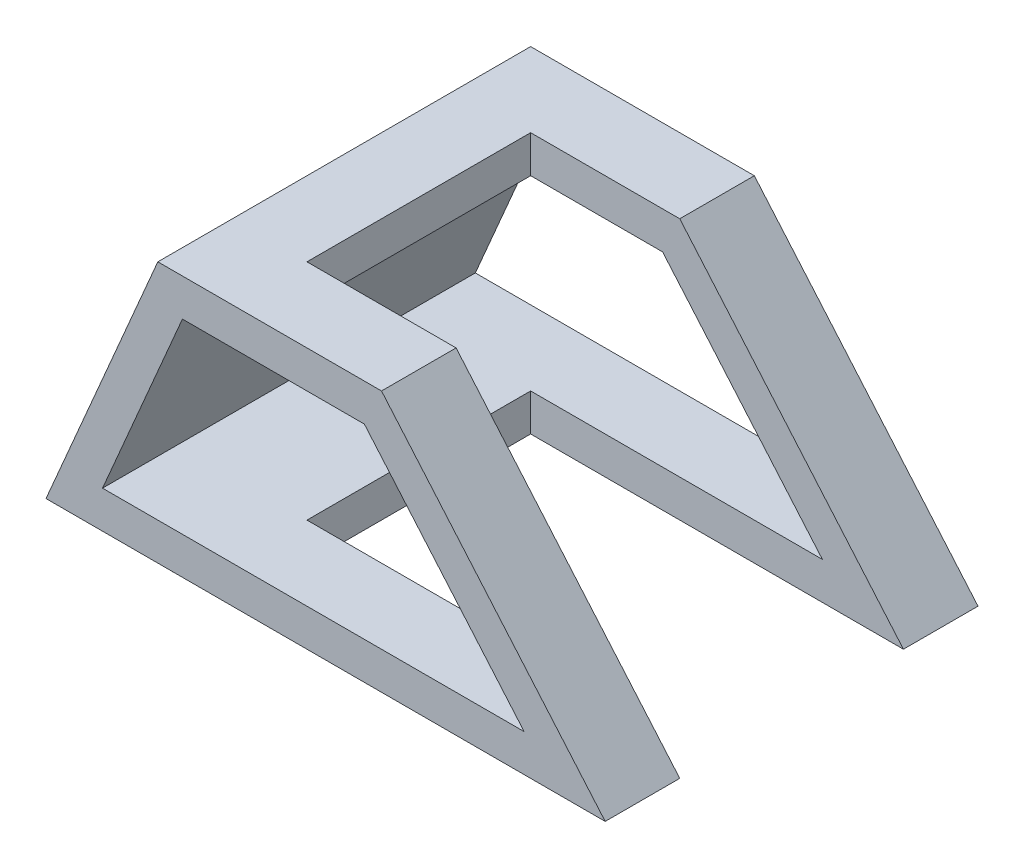
ISO-10303-21;
HEADER;
FILE_DESCRIPTION(('STEP AP214'),'2;1');
FILE_NAME('part.step','',(''),(''),'','','');
FILE_SCHEMA(('AUTOMOTIVE_DESIGN { 1 0 10303 214 1 1 1 1 }'));
ENDSEC;
DATA;
#1=APPLICATION_CONTEXT('core data for automotive mechanical design processes');
#2=APPLICATION_PROTOCOL_DEFINITION('international standard','automotive_design',2000,#1);
#3=PRODUCT_CONTEXT('',#1,'mechanical');
#4=PRODUCT('Part','Part','',(#3));
#5=PRODUCT_RELATED_PRODUCT_CATEGORY('part','',(#4));
#6=PRODUCT_DEFINITION_FORMATION('','',#4);
#7=PRODUCT_DEFINITION_CONTEXT('part definition',#1,'design');
#8=PRODUCT_DEFINITION('design','',#6,#7);
#9=PRODUCT_DEFINITION_SHAPE('','',#8);
#10=(LENGTH_UNIT() NAMED_UNIT(*) SI_UNIT(.MILLI.,.METRE.));
#11=(NAMED_UNIT(*) PLANE_ANGLE_UNIT() SI_UNIT($,.RADIAN.));
#12=(NAMED_UNIT(*) SI_UNIT($,.STERADIAN.) SOLID_ANGLE_UNIT());
#13=UNCERTAINTY_MEASURE_WITH_UNIT(LENGTH_MEASURE(1.E-05),#10,'distance_accuracy_value','');
#14=(GEOMETRIC_REPRESENTATION_CONTEXT(3) GLOBAL_UNCERTAINTY_ASSIGNED_CONTEXT((#13)) GLOBAL_UNIT_ASSIGNED_CONTEXT((#10,
#11,#12)) REPRESENTATION_CONTEXT('',''));
#15=CARTESIAN_POINT('',(0.,0.,0.));
#16=DIRECTION('',(0.,0.,1.));
#17=DIRECTION('',(1.,0.,0.));
#18=AXIS2_PLACEMENT_3D('',#15,#16,#17);
#19=CARTESIAN_POINT('',(150.,0.,50.));
#20=DIRECTION('',(0.,1.,0.));
#21=DIRECTION('',(0.,0.,1.));
#22=AXIS2_PLACEMENT_3D('',#19,#20,#21);
#23=PLANE('',#22);
#24=DIRECTION('',(-1.,0.,0.));
#25=VECTOR('',#24,1.);
#26=CARTESIAN_POINT('',(150.,0.,-30.));
#27=LINE('',#26,#25);
#28=CARTESIAN_POINT('',(150.,0.,-30.));
#29=VERTEX_POINT('',#28);
#30=CARTESIAN_POINT('',(50.,0.,-30.));
#31=VERTEX_POINT('',#30);
#32=EDGE_CURVE('E173',#29,#31,#27,.T.);
#33=ORIENTED_EDGE('',*,*,#32,.T.);
#34=DIRECTION('',(0.,0.,1.));
#35=VECTOR('',#34,1.);
#36=CARTESIAN_POINT('',(50.,0.,30.));
#37=LINE('',#36,#35);
#38=CARTESIAN_POINT('',(50.,0.,30.));
#39=VERTEX_POINT('',#38);
#40=EDGE_CURVE('E176',#31,#39,#37,.T.);
#41=ORIENTED_EDGE('',*,*,#40,.T.);
#42=DIRECTION('',(1.,0.,0.));
#43=VECTOR('',#42,1.);
#44=CARTESIAN_POINT('',(150.,0.,30.));
#45=LINE('',#44,#43);
#46=CARTESIAN_POINT('',(150.,0.,30.));
#47=VERTEX_POINT('',#46);
#48=EDGE_CURVE('E158',#39,#47,#45,.T.);
#49=ORIENTED_EDGE('',*,*,#48,.T.);
#50=DIRECTION('',(0.,0.,-1.));
#51=VECTOR('',#50,1.);
#52=CARTESIAN_POINT('',(150.,0.,50.));
#53=LINE('',#52,#51);
#54=CARTESIAN_POINT('',(150.,0.,50.));
#55=VERTEX_POINT('',#54);
#56=EDGE_CURVE('E261',#55,#47,#53,.T.);
#57=ORIENTED_EDGE('',*,*,#56,.F.);
#58=DIRECTION('',(1.,0.,0.));
#59=VECTOR('',#58,1.);
#60=CARTESIAN_POINT('',(150.,0.,50.));
#61=LINE('',#60,#59);
#62=CARTESIAN_POINT('',(0.,0.,50.));
#63=VERTEX_POINT('',#62);
#64=EDGE_CURVE('E233',#63,#55,#61,.T.);
#65=ORIENTED_EDGE('',*,*,#64,.F.);
#66=DIRECTION('',(0.,0.,-1.));
#67=VECTOR('',#66,1.);
#68=CARTESIAN_POINT('',(0.,0.,50.));
#69=LINE('',#68,#67);
#70=CARTESIAN_POINT('',(0.,0.,-50.));
#71=VERTEX_POINT('',#70);
#72=EDGE_CURVE('E243',#63,#71,#69,.T.);
#73=ORIENTED_EDGE('',*,*,#72,.T.);
#74=DIRECTION('',(1.,0.,0.));
#75=VECTOR('',#74,1.);
#76=CARTESIAN_POINT('',(150.,0.,-50.));
#77=LINE('',#76,#75);
#78=CARTESIAN_POINT('',(150.,0.,-50.));
#79=VERTEX_POINT('',#78);
#80=EDGE_CURVE('E232',#71,#79,#77,.T.);
#81=ORIENTED_EDGE('',*,*,#80,.T.);
#82=EDGE_CURVE('E260',#29,#79,#53,.T.);
#83=ORIENTED_EDGE('',*,*,#82,.F.);
#84=EDGE_LOOP('',(#33,#41,#49,#57,#65,#73,#81,#83));
#85=FACE_BOUND('',#84,.T.);
#86=ADVANCED_FACE('F37',(#85),#23,.F.);
#87=CARTESIAN_POINT('',(90.,70.,50.));
#88=DIRECTION('',(-0.759256602365297,-0.650791373455968,0.));
#89=DIRECTION('',(0.650791373455968,-0.759256602365297,0.));
#90=AXIS2_PLACEMENT_3D('',#87,#88,#89);
#91=PLANE('',#90);
#92=DIRECTION('',(-0.650791373455968,0.759256602365297,0.));
#93=VECTOR('',#92,1.);
#94=CARTESIAN_POINT('',(90.,70.,-30.));
#95=LINE('',#94,#93);
#96=CARTESIAN_POINT('',(90.,70.,-30.));
#97=VERTEX_POINT('',#96);
#98=EDGE_CURVE('E153',#29,#97,#95,.T.);
#99=ORIENTED_EDGE('',*,*,#98,.F.);
#100=ORIENTED_EDGE('',*,*,#82,.T.);
#101=DIRECTION('',(-0.650791373455968,0.759256602365297,0.));
#102=VECTOR('',#101,1.);
#103=CARTESIAN_POINT('',(90.,70.,-50.));
#104=LINE('',#103,#102);
#105=CARTESIAN_POINT('',(90.,70.,-50.));
#106=VERTEX_POINT('',#105);
#107=EDGE_CURVE('E246',#79,#106,#104,.T.);
#108=ORIENTED_EDGE('',*,*,#107,.T.);
#109=DIRECTION('',(0.,0.,-1.));
#110=VECTOR('',#109,1.);
#111=CARTESIAN_POINT('',(90.,70.,50.));
#112=LINE('',#111,#110);
#113=EDGE_CURVE('E257',#97,#106,#112,.T.);
#114=ORIENTED_EDGE('',*,*,#113,.F.);
#115=EDGE_LOOP('',(#99,#100,#108,#114));
#116=FACE_BOUND('',#115,.T.);
#117=ADVANCED_FACE('F286',(#116),#91,.F.);
#118=DIRECTION('',(0.650791373455968,-0.759256602365297,0.));
#119=VECTOR('',#118,1.);
#120=CARTESIAN_POINT('',(90.,70.,30.));
#121=LINE('',#120,#119);
#122=CARTESIAN_POINT('',(90.,70.,30.));
#123=VERTEX_POINT('',#122);
#124=EDGE_CURVE('E186',#123,#47,#121,.T.);
#125=ORIENTED_EDGE('',*,*,#124,.F.);
#126=CARTESIAN_POINT('',(90.,70.,50.));
#127=VERTEX_POINT('',#126);
#128=EDGE_CURVE('E258',#127,#123,#112,.T.);
#129=ORIENTED_EDGE('',*,*,#128,.F.);
#130=DIRECTION('',(-0.650791373455968,0.759256602365297,0.));
#131=VECTOR('',#130,1.);
#132=CARTESIAN_POINT('',(90.,70.,50.));
#133=LINE('',#132,#131);
#134=EDGE_CURVE('E236',#55,#127,#133,.T.);
#135=ORIENTED_EDGE('',*,*,#134,.F.);
#136=ORIENTED_EDGE('',*,*,#56,.T.);
#137=EDGE_LOOP('',(#125,#129,#135,#136));
#138=FACE_BOUND('',#137,.T.);
#139=ADVANCED_FACE('F308',(#138),#91,.F.);
#140=CARTESIAN_POINT('',(30.,70.,50.));
#141=DIRECTION('',(0.,-1.,0.));
#142=DIRECTION('',(0.,0.,-1.));
#143=AXIS2_PLACEMENT_3D('',#140,#141,#142);
#144=PLANE('',#143);
#145=DIRECTION('',(-1.,0.,0.));
#146=VECTOR('',#145,1.);
#147=CARTESIAN_POINT('',(150.,70.,-30.));
#148=LINE('',#147,#146);
#149=CARTESIAN_POINT('',(50.,70.,-30.));
#150=VERTEX_POINT('',#149);
#151=EDGE_CURVE('E148',#97,#150,#148,.T.);
#152=ORIENTED_EDGE('',*,*,#151,.F.);
#153=ORIENTED_EDGE('',*,*,#113,.T.);
#154=DIRECTION('',(-1.,0.,0.));
#155=VECTOR('',#154,1.);
#156=CARTESIAN_POINT('',(30.,70.,-50.));
#157=LINE('',#156,#155);
#158=CARTESIAN_POINT('',(30.,70.,-50.));
#159=VERTEX_POINT('',#158);
#160=EDGE_CURVE('E249',#106,#159,#157,.T.);
#161=ORIENTED_EDGE('',*,*,#160,.T.);
#162=DIRECTION('',(0.,0.,-1.));
#163=VECTOR('',#162,1.);
#164=CARTESIAN_POINT('',(30.,70.,50.));
#165=LINE('',#164,#163);
#166=CARTESIAN_POINT('',(30.,70.,50.));
#167=VERTEX_POINT('',#166);
#168=EDGE_CURVE('E254',#167,#159,#165,.T.);
#169=ORIENTED_EDGE('',*,*,#168,.F.);
#170=DIRECTION('',(-1.,0.,0.));
#171=VECTOR('',#170,1.);
#172=CARTESIAN_POINT('',(30.,70.,50.));
#173=LINE('',#172,#171);
#174=EDGE_CURVE('E239',#127,#167,#173,.T.);
#175=ORIENTED_EDGE('',*,*,#174,.F.);
#176=ORIENTED_EDGE('',*,*,#128,.T.);
#177=DIRECTION('',(1.,0.,0.));
#178=VECTOR('',#177,1.);
#179=CARTESIAN_POINT('',(150.,70.,30.));
#180=LINE('',#179,#178);
#181=CARTESIAN_POINT('',(50.,70.,30.));
#182=VERTEX_POINT('',#181);
#183=EDGE_CURVE('E168',#182,#123,#180,.T.);
#184=ORIENTED_EDGE('',*,*,#183,.F.);
#185=DIRECTION('',(0.,0.,1.));
#186=VECTOR('',#185,1.);
#187=CARTESIAN_POINT('',(50.,70.,30.));
#188=LINE('',#187,#186);
#189=EDGE_CURVE('E157',#150,#182,#188,.T.);
#190=ORIENTED_EDGE('',*,*,#189,.F.);
#191=EDGE_LOOP('',(#152,#153,#161,#169,#175,#176,#184,#190));
#192=FACE_BOUND('',#191,.T.);
#193=ADVANCED_FACE('F166',(#192),#144,.F.);
#194=CARTESIAN_POINT('',(128.257793632439,10.,50.));
#195=DIRECTION('',(0.,1.,0.));
#196=DIRECTION('',(-1.,0.,0.));
#197=AXIS2_PLACEMENT_3D('',#194,#195,#196);
#198=PLANE('',#197);
#199=DIRECTION('',(0.,0.,-1.));
#200=VECTOR('',#199,1.);
#201=CARTESIAN_POINT('',(50.,10.,50.));
#202=LINE('',#201,#200);
#203=CARTESIAN_POINT('',(50.,10.,30.));
#204=VERTEX_POINT('',#203);
#205=CARTESIAN_POINT('',(50.,10.,-30.));
#206=VERTEX_POINT('',#205);
#207=EDGE_CURVE('E188',#204,#206,#202,.T.);
#208=ORIENTED_EDGE('',*,*,#207,.T.);
#209=DIRECTION('',(1.,0.,0.));
#210=VECTOR('',#209,1.);
#211=CARTESIAN_POINT('',(128.257793632439,10.,-30.));
#212=LINE('',#211,#210);
#213=CARTESIAN_POINT('',(128.257793632439,9.99999999999999,-30.));
#214=VERTEX_POINT('',#213);
#215=EDGE_CURVE('E194',#206,#214,#212,.T.);
#216=ORIENTED_EDGE('',*,*,#215,.T.);
#217=DIRECTION('',(0.,0.,-1.));
#218=VECTOR('',#217,1.);
#219=CARTESIAN_POINT('',(128.257793632439,10.,50.));
#220=LINE('',#219,#218);
#221=CARTESIAN_POINT('',(128.257793632439,10.,-50.));
#222=VERTEX_POINT('',#221);
#223=EDGE_CURVE('E228',#214,#222,#220,.T.);
#224=ORIENTED_EDGE('',*,*,#223,.T.);
#225=DIRECTION('',(1.,0.,0.));
#226=VECTOR('',#225,1.);
#227=CARTESIAN_POINT('',(128.257793632439,10.,-50.));
#228=LINE('',#227,#226);
#229=CARTESIAN_POINT('',(15.1653901512342,10.,-50.));
#230=VERTEX_POINT('',#229);
#231=EDGE_CURVE('E198',#230,#222,#228,.T.);
#232=ORIENTED_EDGE('',*,*,#231,.F.);
#233=DIRECTION('',(0.,0.,-1.));
#234=VECTOR('',#233,1.);
#235=CARTESIAN_POINT('',(15.1653901512342,10.,50.));
#236=LINE('',#235,#234);
#237=CARTESIAN_POINT('',(15.1653901512342,10.,50.));
#238=VERTEX_POINT('',#237);
#239=EDGE_CURVE('E209',#238,#230,#236,.T.);
#240=ORIENTED_EDGE('',*,*,#239,.F.);
#241=DIRECTION('',(1.,0.,0.));
#242=VECTOR('',#241,1.);
#243=CARTESIAN_POINT('',(128.257793632439,10.,50.));
#244=LINE('',#243,#242);
#245=CARTESIAN_POINT('',(128.257793632439,10.,50.));
#246=VERTEX_POINT('',#245);
#247=EDGE_CURVE('E199',#238,#246,#244,.T.);
#248=ORIENTED_EDGE('',*,*,#247,.T.);
#249=CARTESIAN_POINT('',(128.257793632439,10.,30.));
#250=VERTEX_POINT('',#249);
#251=EDGE_CURVE('E229',#246,#250,#220,.T.);
#252=ORIENTED_EDGE('',*,*,#251,.T.);
#253=DIRECTION('',(-1.,0.,0.));
#254=VECTOR('',#253,1.);
#255=CARTESIAN_POINT('',(128.257793632439,10.,30.));
#256=LINE('',#255,#254);
#257=EDGE_CURVE('E183',#250,#204,#256,.T.);
#258=ORIENTED_EDGE('',*,*,#257,.T.);
#259=EDGE_LOOP('',(#208,#216,#224,#232,#240,#248,#252,#258));
#260=FACE_BOUND('',#259,.T.);
#261=ADVANCED_FACE('F275',(#260),#198,.T.);
#262=CARTESIAN_POINT('',(85.4006507752959,60.,50.));
#263=DIRECTION('',(-0.759256602365296,-0.650791373455969,0.));
#264=DIRECTION('',(0.650791373455969,-0.759256602365296,0.));
#265=AXIS2_PLACEMENT_3D('',#262,#263,#264);
#266=PLANE('',#265);
#267=ORIENTED_EDGE('',*,*,#223,.F.);
#268=DIRECTION('',(-0.650791373455969,0.759256602365296,0.));
#269=VECTOR('',#268,1.);
#270=CARTESIAN_POINT('',(85.4006507752959,60.,-30.));
#271=LINE('',#270,#269);
#272=CARTESIAN_POINT('',(85.4006507752959,60.,-30.));
#273=VERTEX_POINT('',#272);
#274=EDGE_CURVE('E191',#214,#273,#271,.T.);
#275=ORIENTED_EDGE('',*,*,#274,.T.);
#276=DIRECTION('',(0.,0.,-1.));
#277=VECTOR('',#276,1.);
#278=CARTESIAN_POINT('',(85.4006507752959,60.,50.));
#279=LINE('',#278,#277);
#280=CARTESIAN_POINT('',(85.4006507752959,60.,-50.));
#281=VERTEX_POINT('',#280);
#282=EDGE_CURVE('E224',#273,#281,#279,.T.);
#283=ORIENTED_EDGE('',*,*,#282,.T.);
#284=DIRECTION('',(-0.650791373455969,0.759256602365296,0.));
#285=VECTOR('',#284,1.);
#286=CARTESIAN_POINT('',(85.4006507752959,60.,-50.));
#287=LINE('',#286,#285);
#288=EDGE_CURVE('E212',#222,#281,#287,.T.);
#289=ORIENTED_EDGE('',*,*,#288,.F.);
#290=EDGE_LOOP('',(#267,#275,#283,#289));
#291=FACE_BOUND('',#290,.T.);
#292=ADVANCED_FACE('F272',(#291),#266,.T.);
#293=CARTESIAN_POINT('',(85.4006507752959,60.,50.));
#294=VERTEX_POINT('',#293);
#295=CARTESIAN_POINT('',(85.4006507752959,60.,30.));
#296=VERTEX_POINT('',#295);
#297=EDGE_CURVE('E225',#294,#296,#279,.T.);
#298=ORIENTED_EDGE('',*,*,#297,.T.);
#299=DIRECTION('',(0.650791373455969,-0.759256602365296,0.));
#300=VECTOR('',#299,1.);
#301=CARTESIAN_POINT('',(85.4006507752959,60.,30.));
#302=LINE('',#301,#300);
#303=EDGE_CURVE('E57',#296,#250,#302,.T.);
#304=ORIENTED_EDGE('',*,*,#303,.T.);
#305=ORIENTED_EDGE('',*,*,#251,.F.);
#306=DIRECTION('',(-0.650791373455969,0.759256602365296,0.));
#307=VECTOR('',#306,1.);
#308=CARTESIAN_POINT('',(85.4006507752959,60.,50.));
#309=LINE('',#308,#307);
#310=EDGE_CURVE('E201',#246,#294,#309,.T.);
#311=ORIENTED_EDGE('',*,*,#310,.T.);
#312=EDGE_LOOP('',(#298,#304,#305,#311));
#313=FACE_BOUND('',#312,.T.);
#314=ADVANCED_FACE('F314',(#313),#266,.T.);
#315=CARTESIAN_POINT('',(36.5939615798056,60.,50.));
#316=DIRECTION('',(0.,-1.,0.));
#317=DIRECTION('',(0.,0.,-1.));
#318=AXIS2_PLACEMENT_3D('',#315,#316,#317);
#319=PLANE('',#318);
#320=ORIENTED_EDGE('',*,*,#282,.F.);
#321=DIRECTION('',(-1.,0.,0.));
#322=VECTOR('',#321,1.);
#323=CARTESIAN_POINT('',(36.5939615798056,60.,-30.));
#324=LINE('',#323,#322);
#325=CARTESIAN_POINT('',(50.,60.,-30.));
#326=VERTEX_POINT('',#325);
#327=EDGE_CURVE('E11',#273,#326,#324,.T.);
#328=ORIENTED_EDGE('',*,*,#327,.T.);
#329=DIRECTION('',(0.,0.,1.));
#330=VECTOR('',#329,1.);
#331=CARTESIAN_POINT('',(50.,60.,50.));
#332=LINE('',#331,#330);
#333=CARTESIAN_POINT('',(50.,60.,30.));
#334=VERTEX_POINT('',#333);
#335=EDGE_CURVE('E44',#326,#334,#332,.T.);
#336=ORIENTED_EDGE('',*,*,#335,.T.);
#337=DIRECTION('',(1.,0.,0.));
#338=VECTOR('',#337,1.);
#339=CARTESIAN_POINT('',(36.5939615798056,60.,30.));
#340=LINE('',#339,#338);
#341=EDGE_CURVE('E264',#334,#296,#340,.T.);
#342=ORIENTED_EDGE('',*,*,#341,.T.);
#343=ORIENTED_EDGE('',*,*,#297,.F.);
#344=DIRECTION('',(-1.,0.,0.));
#345=VECTOR('',#344,1.);
#346=CARTESIAN_POINT('',(36.5939615798056,60.,50.));
#347=LINE('',#346,#345);
#348=CARTESIAN_POINT('',(36.5939615798056,60.,50.));
#349=VERTEX_POINT('',#348);
#350=EDGE_CURVE('E204',#294,#349,#347,.T.);
#351=ORIENTED_EDGE('',*,*,#350,.T.);
#352=DIRECTION('',(0.,0.,-1.));
#353=VECTOR('',#352,1.);
#354=CARTESIAN_POINT('',(36.5939615798056,60.,50.));
#355=LINE('',#354,#353);
#356=CARTESIAN_POINT('',(36.5939615798056,60.,-50.));
#357=VERTEX_POINT('',#356);
#358=EDGE_CURVE('E222',#349,#357,#355,.T.);
#359=ORIENTED_EDGE('',*,*,#358,.T.);
#360=DIRECTION('',(-1.,0.,0.));
#361=VECTOR('',#360,1.);
#362=CARTESIAN_POINT('',(36.5939615798056,60.,-50.));
#363=LINE('',#362,#361);
#364=EDGE_CURVE('E215',#281,#357,#363,.T.);
#365=ORIENTED_EDGE('',*,*,#364,.F.);
#366=EDGE_LOOP('',(#320,#328,#336,#342,#343,#351,#359,#365));
#367=FACE_BOUND('',#366,.T.);
#368=ADVANCED_FACE('F267',(#367),#319,.T.);
#369=CARTESIAN_POINT('',(0.,0.,50.));
#370=DIRECTION('',(0.,0.,-1.));
#371=DIRECTION('',(-1.,0.,0.));
#372=AXIS2_PLACEMENT_3D('',#369,#370,#371);
#373=PLANE('',#372);
#374=ORIENTED_EDGE('',*,*,#64,.T.);
#375=ORIENTED_EDGE('',*,*,#134,.T.);
#376=ORIENTED_EDGE('',*,*,#174,.T.);
#377=DIRECTION('',(-0.393919298579168,-0.919145030018058,0.));
#378=VECTOR('',#377,1.);
#379=CARTESIAN_POINT('',(0.,0.,50.));
#380=LINE('',#379,#378);
#381=EDGE_CURVE('E241',#167,#63,#380,.T.);
#382=ORIENTED_EDGE('',*,*,#381,.T.);
#383=EDGE_LOOP('',(#374,#375,#376,#382));
#384=FACE_BOUND('',#383,.T.);
#385=ORIENTED_EDGE('',*,*,#247,.F.);
#386=DIRECTION('',(-0.393919298579168,-0.919145030018058,0.));
#387=VECTOR('',#386,1.);
#388=CARTESIAN_POINT('',(15.1653901512342,10.,50.));
#389=LINE('',#388,#387);
#390=EDGE_CURVE('E207',#349,#238,#389,.T.);
#391=ORIENTED_EDGE('',*,*,#390,.F.);
#392=ORIENTED_EDGE('',*,*,#350,.F.);
#393=ORIENTED_EDGE('',*,*,#310,.F.);
#394=EDGE_LOOP('',(#385,#391,#392,#393));
#395=FACE_BOUND('',#394,.T.);
#396=ADVANCED_FACE('F303',(#384,#395),#373,.F.);
#397=CARTESIAN_POINT('',(0.,0.,-50.));
#398=DIRECTION('',(0.,0.,-1.));
#399=DIRECTION('',(-1.,0.,0.));
#400=AXIS2_PLACEMENT_3D('',#397,#398,#399);
#401=PLANE('',#400);
#402=ORIENTED_EDGE('',*,*,#80,.F.);
#403=DIRECTION('',(-0.393919298579168,-0.919145030018058,0.));
#404=VECTOR('',#403,1.);
#405=CARTESIAN_POINT('',(0.,0.,-50.));
#406=LINE('',#405,#404);
#407=EDGE_CURVE('E237',#159,#71,#406,.T.);
#408=ORIENTED_EDGE('',*,*,#407,.F.);
#409=ORIENTED_EDGE('',*,*,#160,.F.);
#410=ORIENTED_EDGE('',*,*,#107,.F.);
#411=EDGE_LOOP('',(#402,#408,#409,#410));
#412=FACE_BOUND('',#411,.T.);
#413=DIRECTION('',(-0.393919298579168,-0.919145030018058,0.));
#414=VECTOR('',#413,1.);
#415=CARTESIAN_POINT('',(15.1653901512342,10.,-50.));
#416=LINE('',#415,#414);
#417=EDGE_CURVE('E202',#357,#230,#416,.T.);
#418=ORIENTED_EDGE('',*,*,#417,.T.);
#419=ORIENTED_EDGE('',*,*,#231,.T.);
#420=ORIENTED_EDGE('',*,*,#288,.T.);
#421=ORIENTED_EDGE('',*,*,#364,.T.);
#422=EDGE_LOOP('',(#418,#419,#420,#421));
#423=FACE_BOUND('',#422,.T.);
#424=ADVANCED_FACE('F298',(#412,#423),#401,.T.);
#425=CARTESIAN_POINT('',(0.,0.,50.));
#426=DIRECTION('',(0.919145030018058,-0.393919298579168,0.));
#427=DIRECTION('',(0.393919298579168,0.919145030018058,0.));
#428=AXIS2_PLACEMENT_3D('',#425,#426,#427);
#429=PLANE('',#428);
#430=ORIENTED_EDGE('',*,*,#407,.T.);
#431=ORIENTED_EDGE('',*,*,#72,.F.);
#432=ORIENTED_EDGE('',*,*,#381,.F.);
#433=ORIENTED_EDGE('',*,*,#168,.T.);
#434=EDGE_LOOP('',(#430,#431,#432,#433));
#435=FACE_BOUND('',#434,.T.);
#436=ADVANCED_FACE('F295',(#435),#429,.F.);
#437=CARTESIAN_POINT('',(15.1653901512342,10.,50.));
#438=DIRECTION('',(0.919145030018058,-0.393919298579168,0.));
#439=DIRECTION('',(0.393919298579168,0.919145030018058,0.));
#440=AXIS2_PLACEMENT_3D('',#437,#438,#439);
#441=PLANE('',#440);
#442=ORIENTED_EDGE('',*,*,#417,.F.);
#443=ORIENTED_EDGE('',*,*,#358,.F.);
#444=ORIENTED_EDGE('',*,*,#390,.T.);
#445=ORIENTED_EDGE('',*,*,#239,.T.);
#446=EDGE_LOOP('',(#442,#443,#444,#445));
#447=FACE_BOUND('',#446,.T.);
#448=ADVANCED_FACE('F319',(#447),#441,.T.);
#449=CARTESIAN_POINT('',(150.,70.,-30.));
#450=DIRECTION('',(0.,0.,1.));
#451=DIRECTION('',(1.,0.,0.));
#452=AXIS2_PLACEMENT_3D('',#449,#450,#451);
#453=PLANE('',#452);
#454=ORIENTED_EDGE('',*,*,#98,.T.);
#455=ORIENTED_EDGE('',*,*,#151,.T.);
#456=DIRECTION('',(0.,-1.,0.));
#457=VECTOR('',#456,1.);
#458=CARTESIAN_POINT('',(50.,70.,-30.));
#459=LINE('',#458,#457);
#460=EDGE_CURVE('E151',#150,#326,#459,.T.);
#461=ORIENTED_EDGE('',*,*,#460,.T.);
#462=ORIENTED_EDGE('',*,*,#327,.F.);
#463=ORIENTED_EDGE('',*,*,#274,.F.);
#464=ORIENTED_EDGE('',*,*,#215,.F.);
#465=EDGE_CURVE('E164',#206,#31,#459,.T.);
#466=ORIENTED_EDGE('',*,*,#465,.T.);
#467=ORIENTED_EDGE('',*,*,#32,.F.);
#468=EDGE_LOOP('',(#454,#455,#461,#462,#463,#464,#466,#467));
#469=FACE_BOUND('',#468,.T.);
#470=ADVANCED_FACE('F150',(#469),#453,.T.);
#471=CARTESIAN_POINT('',(50.,70.,30.));
#472=DIRECTION('',(1.,0.,0.));
#473=DIRECTION('',(0.,0.,-1.));
#474=AXIS2_PLACEMENT_3D('',#471,#472,#473);
#475=PLANE('',#474);
#476=DIRECTION('',(0.,-1.,0.));
#477=VECTOR('',#476,1.);
#478=CARTESIAN_POINT('',(50.,70.,30.));
#479=LINE('',#478,#477);
#480=EDGE_CURVE('E170',#204,#39,#479,.T.);
#481=ORIENTED_EDGE('',*,*,#480,.T.);
#482=ORIENTED_EDGE('',*,*,#40,.F.);
#483=ORIENTED_EDGE('',*,*,#465,.F.);
#484=ORIENTED_EDGE('',*,*,#207,.F.);
#485=EDGE_LOOP('',(#481,#482,#483,#484));
#486=FACE_BOUND('',#485,.T.);
#487=ADVANCED_FACE('F280',(#486),#475,.T.);
#488=CARTESIAN_POINT('',(150.,70.,30.));
#489=DIRECTION('',(0.,0.,-1.));
#490=DIRECTION('',(-1.,0.,0.));
#491=AXIS2_PLACEMENT_3D('',#488,#489,#490);
#492=PLANE('',#491);
#493=ORIENTED_EDGE('',*,*,#124,.T.);
#494=ORIENTED_EDGE('',*,*,#48,.F.);
#495=ORIENTED_EDGE('',*,*,#480,.F.);
#496=ORIENTED_EDGE('',*,*,#257,.F.);
#497=ORIENTED_EDGE('',*,*,#303,.F.);
#498=ORIENTED_EDGE('',*,*,#341,.F.);
#499=EDGE_CURVE('E51',#182,#334,#479,.T.);
#500=ORIENTED_EDGE('',*,*,#499,.F.);
#501=ORIENTED_EDGE('',*,*,#183,.T.);
#502=EDGE_LOOP('',(#493,#494,#495,#496,#497,#498,#500,#501));
#503=FACE_BOUND('',#502,.T.);
#504=ADVANCED_FACE('F309',(#503),#492,.T.);
#505=ORIENTED_EDGE('',*,*,#460,.F.);
#506=ORIENTED_EDGE('',*,*,#189,.T.);
#507=ORIENTED_EDGE('',*,*,#499,.T.);
#508=ORIENTED_EDGE('',*,*,#335,.F.);
#509=EDGE_LOOP('',(#505,#506,#507,#508));
#510=FACE_BOUND('',#509,.T.);
#511=ADVANCED_FACE('F161',(#510),#475,.T.);
#512=CLOSED_SHELL('',(#86,#117,#139,#193,#261,#292,#314,#368,#396,#424,#436,#448,#470,#487,#504,#511));
#513=MANIFOLD_SOLID_BREP('B2',#512);
#514=ADVANCED_BREP_SHAPE_REPRESENTATION('',(#18,#513),#14);
#515=SHAPE_DEFINITION_REPRESENTATION(#9,#514);
ENDSEC;
END-ISO-10303-21;
